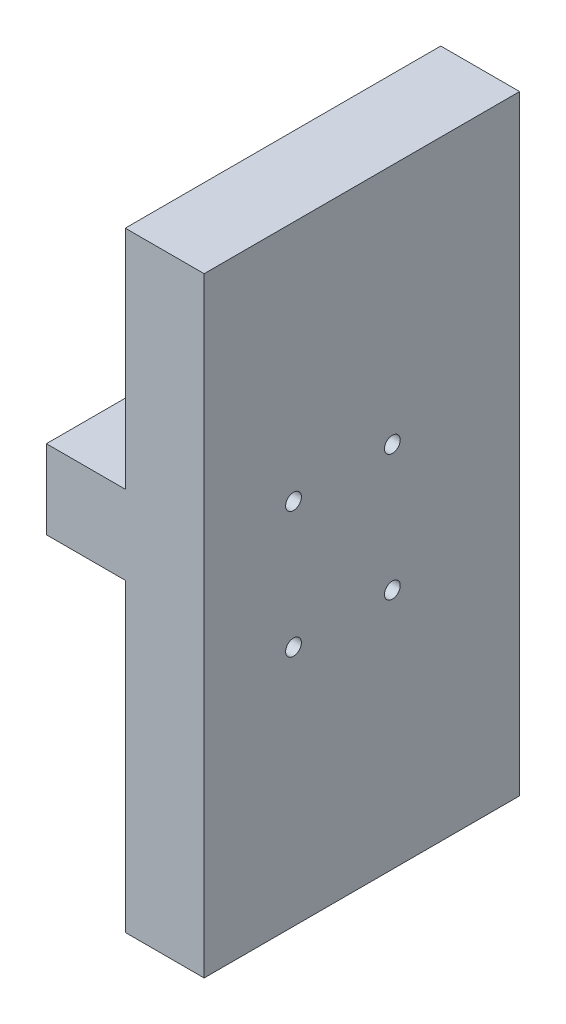
ISO-10303-21;
HEADER;
FILE_DESCRIPTION(('STEP AP214'),'2;1');
FILE_NAME('part.step','',(''),(''),'','','');
FILE_SCHEMA(('AUTOMOTIVE_DESIGN { 1 0 10303 214 1 1 1 1 }'));
ENDSEC;
DATA;
#1=APPLICATION_CONTEXT('core data for automotive mechanical design processes');
#2=APPLICATION_PROTOCOL_DEFINITION('international standard','automotive_design',2000,#1);
#3=PRODUCT_CONTEXT('',#1,'mechanical');
#4=PRODUCT('Part','Part','',(#3));
#5=PRODUCT_RELATED_PRODUCT_CATEGORY('part','',(#4));
#6=PRODUCT_DEFINITION_FORMATION('','',#4);
#7=PRODUCT_DEFINITION_CONTEXT('part definition',#1,'design');
#8=PRODUCT_DEFINITION('design','',#6,#7);
#9=PRODUCT_DEFINITION_SHAPE('','',#8);
#10=(LENGTH_UNIT() NAMED_UNIT(*) SI_UNIT(.MILLI.,.METRE.));
#11=(NAMED_UNIT(*) PLANE_ANGLE_UNIT() SI_UNIT($,.RADIAN.));
#12=(NAMED_UNIT(*) SI_UNIT($,.STERADIAN.) SOLID_ANGLE_UNIT());
#13=UNCERTAINTY_MEASURE_WITH_UNIT(LENGTH_MEASURE(1.E-05),#10,'distance_accuracy_value','');
#14=(GEOMETRIC_REPRESENTATION_CONTEXT(3) GLOBAL_UNCERTAINTY_ASSIGNED_CONTEXT((#13)) GLOBAL_UNIT_ASSIGNED_CONTEXT((#10,
#11,#12)) REPRESENTATION_CONTEXT('',''));
#15=CARTESIAN_POINT('',(0.,0.,0.));
#16=DIRECTION('',(0.,0.,1.));
#17=DIRECTION('',(1.,0.,0.));
#18=AXIS2_PLACEMENT_3D('',#15,#16,#17);
#19=CARTESIAN_POINT('',(0.,0.,0.));
#20=DIRECTION('',(-1.,0.,0.));
#21=DIRECTION('',(0.,0.,1.));
#22=AXIS2_PLACEMENT_3D('',#19,#20,#21);
#23=PLANE('',#22);
#24=CARTESIAN_POINT('',(0.,46.,-35.8));
#25=DIRECTION('',(-1.,0.,0.));
#26=DIRECTION('',(0.,0.,1.));
#27=AXIS2_PLACEMENT_3D('',#24,#25,#26);
#28=CIRCLE('',#27,1.5);
#29=CARTESIAN_POINT('',(0.,46.,-34.3));
#30=VERTEX_POINT('',#29);
#31=EDGE_CURVE('E258',#30,#30,#28,.T.);
#32=ORIENTED_EDGE('',*,*,#31,.F.);
#33=EDGE_LOOP('',(#32));
#34=FACE_BOUND('',#33,.T.);
#35=CARTESIAN_POINT('',(0.,70.,-35.8));
#36=DIRECTION('',(-1.,0.,0.));
#37=DIRECTION('',(0.,0.,1.));
#38=AXIS2_PLACEMENT_3D('',#35,#36,#37);
#39=CIRCLE('',#38,1.5);
#40=CARTESIAN_POINT('',(0.,70.,-34.3));
#41=VERTEX_POINT('',#40);
#42=EDGE_CURVE('E252',#41,#41,#39,.T.);
#43=ORIENTED_EDGE('',*,*,#42,.F.);
#44=EDGE_LOOP('',(#43));
#45=FACE_BOUND('',#44,.T.);
#46=CARTESIAN_POINT('',(0.,46.,-17.));
#47=DIRECTION('',(-1.,0.,0.));
#48=DIRECTION('',(0.,0.,1.));
#49=AXIS2_PLACEMENT_3D('',#46,#47,#48);
#50=CIRCLE('',#49,1.5);
#51=CARTESIAN_POINT('',(0.,46.,-15.5));
#52=VERTEX_POINT('',#51);
#53=EDGE_CURVE('E246',#52,#52,#50,.T.);
#54=ORIENTED_EDGE('',*,*,#53,.F.);
#55=EDGE_LOOP('',(#54));
#56=FACE_BOUND('',#55,.T.);
#57=CARTESIAN_POINT('',(0.,70.,-17.));
#58=DIRECTION('',(-1.,0.,0.));
#59=DIRECTION('',(0.,0.,1.));
#60=AXIS2_PLACEMENT_3D('',#57,#58,#59);
#61=CIRCLE('',#60,1.5);
#62=CARTESIAN_POINT('',(0.,70.,-15.5));
#63=VERTEX_POINT('',#62);
#64=EDGE_CURVE('E231',#63,#63,#61,.T.);
#65=ORIENTED_EDGE('',*,*,#64,.F.);
#66=EDGE_LOOP('',(#65));
#67=FACE_BOUND('',#66,.T.);
#68=DIRECTION('',(0.,-1.,0.));
#69=VECTOR('',#68,1.);
#70=CARTESIAN_POINT('',(0.,58.,-15.));
#71=LINE('',#70,#69);
#72=CARTESIAN_POINT('',(0.,73.,-15.));
#73=VERTEX_POINT('',#72);
#74=CARTESIAN_POINT('',(0.,58.,-15.));
#75=VERTEX_POINT('',#74);
#76=EDGE_CURVE('E230',#73,#75,#71,.T.);
#77=ORIENTED_EDGE('',*,*,#76,.F.);
#78=DIRECTION('',(0.,0.,-1.));
#79=VECTOR('',#78,1.);
#80=CARTESIAN_POINT('',(0.,73.,0.));
#81=LINE('',#80,#79);
#82=CARTESIAN_POINT('',(0.,73.,0.));
#83=VERTEX_POINT('',#82);
#84=EDGE_CURVE('E228',#83,#73,#81,.T.);
#85=ORIENTED_EDGE('',*,*,#84,.F.);
#86=DIRECTION('',(0.,-1.,0.));
#87=VECTOR('',#86,1.);
#88=CARTESIAN_POINT('',(0.,0.,0.));
#89=LINE('',#88,#87);
#90=CARTESIAN_POINT('',(0.,116.,0.));
#91=VERTEX_POINT('',#90);
#92=EDGE_CURVE('E148',#91,#83,#89,.T.);
#93=ORIENTED_EDGE('',*,*,#92,.F.);
#94=DIRECTION('',(0.,0.,1.));
#95=VECTOR('',#94,1.);
#96=CARTESIAN_POINT('',(0.,116.,0.));
#97=LINE('',#96,#95);
#98=CARTESIAN_POINT('',(0.,116.,-60.));
#99=VERTEX_POINT('',#98);
#100=EDGE_CURVE('E197',#99,#91,#97,.T.);
#101=ORIENTED_EDGE('',*,*,#100,.F.);
#102=DIRECTION('',(0.,1.,0.));
#103=VECTOR('',#102,1.);
#104=CARTESIAN_POINT('',(0.,0.,-60.));
#105=LINE('',#104,#103);
#106=CARTESIAN_POINT('',(0.,58.,-60.));
#107=VERTEX_POINT('',#106);
#108=EDGE_CURVE('E207',#107,#99,#105,.T.);
#109=ORIENTED_EDGE('',*,*,#108,.F.);
#110=DIRECTION('',(0.,0.,-1.));
#111=VECTOR('',#110,1.);
#112=CARTESIAN_POINT('',(0.,58.,-60.));
#113=LINE('',#112,#111);
#114=CARTESIAN_POINT('',(0.,58.,-45.));
#115=VERTEX_POINT('',#114);
#116=EDGE_CURVE('E58',#115,#107,#113,.T.);
#117=ORIENTED_EDGE('',*,*,#116,.F.);
#118=DIRECTION('',(0.,1.,0.));
#119=VECTOR('',#118,1.);
#120=CARTESIAN_POINT('',(0.,58.,-45.));
#121=LINE('',#120,#119);
#122=CARTESIAN_POINT('',(0.,43.,-45.));
#123=VERTEX_POINT('',#122);
#124=EDGE_CURVE('E152',#123,#115,#121,.T.);
#125=ORIENTED_EDGE('',*,*,#124,.F.);
#126=DIRECTION('',(0.,0.,1.));
#127=VECTOR('',#126,1.);
#128=CARTESIAN_POINT('',(0.,43.,-60.));
#129=LINE('',#128,#127);
#130=CARTESIAN_POINT('',(0.,43.,-60.));
#131=VERTEX_POINT('',#130);
#132=EDGE_CURVE('E149',#131,#123,#129,.T.);
#133=ORIENTED_EDGE('',*,*,#132,.F.);
#134=CARTESIAN_POINT('',(0.,0.,-60.));
#135=VERTEX_POINT('',#134);
#136=EDGE_CURVE('E214',#135,#131,#105,.T.);
#137=ORIENTED_EDGE('',*,*,#136,.F.);
#138=DIRECTION('',(0.,0.,-1.));
#139=VECTOR('',#138,1.);
#140=CARTESIAN_POINT('',(0.,0.,0.));
#141=LINE('',#140,#139);
#142=CARTESIAN_POINT('',(0.,0.,0.));
#143=VERTEX_POINT('',#142);
#144=EDGE_CURVE('E205',#143,#135,#141,.T.);
#145=ORIENTED_EDGE('',*,*,#144,.F.);
#146=CARTESIAN_POINT('',(0.,58.,0.));
#147=VERTEX_POINT('',#146);
#148=EDGE_CURVE('E191',#147,#143,#89,.T.);
#149=ORIENTED_EDGE('',*,*,#148,.F.);
#150=DIRECTION('',(0.,0.,1.));
#151=VECTOR('',#150,1.);
#152=CARTESIAN_POINT('',(0.,58.,0.));
#153=LINE('',#152,#151);
#154=EDGE_CURVE('E143',#75,#147,#153,.T.);
#155=ORIENTED_EDGE('',*,*,#154,.F.);
#156=EDGE_LOOP('',(#77,#85,#93,#101,#109,#117,#125,#133,#137,#145,#149,#155));
#157=FACE_BOUND('',#156,.T.);
#158=ADVANCED_FACE('F33',(#34,#45,#56,#67,#157),#23,.T.);
#159=CARTESIAN_POINT('',(15.,0.,0.));
#160=DIRECTION('',(0.,0.,-1.));
#161=DIRECTION('',(-1.,0.,0.));
#162=AXIS2_PLACEMENT_3D('',#159,#160,#161);
#163=PLANE('',#162);
#164=ORIENTED_EDGE('',*,*,#92,.T.);
#165=DIRECTION('',(1.,0.,0.));
#166=VECTOR('',#165,1.);
#167=CARTESIAN_POINT('',(-15.,73.,0.));
#168=LINE('',#167,#166);
#169=CARTESIAN_POINT('',(-15.,73.,0.));
#170=VERTEX_POINT('',#169);
#171=EDGE_CURVE('E128',#170,#83,#168,.T.);
#172=ORIENTED_EDGE('',*,*,#171,.F.);
#173=DIRECTION('',(0.,1.,0.));
#174=VECTOR('',#173,1.);
#175=CARTESIAN_POINT('',(-15.,58.,0.));
#176=LINE('',#175,#174);
#177=CARTESIAN_POINT('',(-15.,58.,0.));
#178=VERTEX_POINT('',#177);
#179=EDGE_CURVE('E135',#178,#170,#176,.T.);
#180=ORIENTED_EDGE('',*,*,#179,.F.);
#181=DIRECTION('',(1.,0.,0.));
#182=VECTOR('',#181,1.);
#183=CARTESIAN_POINT('',(-15.,58.,0.));
#184=LINE('',#183,#182);
#185=EDGE_CURVE('E241',#178,#147,#184,.T.);
#186=ORIENTED_EDGE('',*,*,#185,.T.);
#187=ORIENTED_EDGE('',*,*,#148,.T.);
#188=DIRECTION('',(-1.,0.,0.));
#189=VECTOR('',#188,1.);
#190=CARTESIAN_POINT('',(15.,0.,0.));
#191=LINE('',#190,#189);
#192=CARTESIAN_POINT('',(15.,0.,0.));
#193=VERTEX_POINT('',#192);
#194=EDGE_CURVE('E11',#193,#143,#191,.T.);
#195=ORIENTED_EDGE('',*,*,#194,.F.);
#196=DIRECTION('',(0.,-1.,0.));
#197=VECTOR('',#196,1.);
#198=CARTESIAN_POINT('',(15.,0.,0.));
#199=LINE('',#198,#197);
#200=CARTESIAN_POINT('',(15.,116.,0.));
#201=VERTEX_POINT('',#200);
#202=EDGE_CURVE('E193',#201,#193,#199,.T.);
#203=ORIENTED_EDGE('',*,*,#202,.F.);
#204=DIRECTION('',(-1.,0.,0.));
#205=VECTOR('',#204,1.);
#206=CARTESIAN_POINT('',(15.,116.,0.));
#207=LINE('',#206,#205);
#208=EDGE_CURVE('E203',#201,#91,#207,.T.);
#209=ORIENTED_EDGE('',*,*,#208,.T.);
#210=EDGE_LOOP('',(#164,#172,#180,#186,#187,#195,#203,#209));
#211=FACE_BOUND('',#210,.T.);
#212=ADVANCED_FACE('F35',(#211),#163,.F.);
#213=CARTESIAN_POINT('',(15.,0.,0.));
#214=DIRECTION('',(0.,1.,0.));
#215=DIRECTION('',(0.,0.,1.));
#216=AXIS2_PLACEMENT_3D('',#213,#214,#215);
#217=PLANE('',#216);
#218=ORIENTED_EDGE('',*,*,#144,.T.);
#219=DIRECTION('',(-1.,0.,0.));
#220=VECTOR('',#219,1.);
#221=CARTESIAN_POINT('',(15.,0.,-60.));
#222=LINE('',#221,#220);
#223=CARTESIAN_POINT('',(15.,0.,-60.));
#224=VERTEX_POINT('',#223);
#225=EDGE_CURVE('E42',#224,#135,#222,.T.);
#226=ORIENTED_EDGE('',*,*,#225,.F.);
#227=DIRECTION('',(0.,0.,-1.));
#228=VECTOR('',#227,1.);
#229=CARTESIAN_POINT('',(15.,0.,0.));
#230=LINE('',#229,#228);
#231=EDGE_CURVE('E196',#193,#224,#230,.T.);
#232=ORIENTED_EDGE('',*,*,#231,.F.);
#233=ORIENTED_EDGE('',*,*,#194,.T.);
#234=EDGE_LOOP('',(#218,#226,#232,#233));
#235=FACE_BOUND('',#234,.T.);
#236=ADVANCED_FACE('F282',(#235),#217,.F.);
#237=CARTESIAN_POINT('',(15.,0.,-60.));
#238=DIRECTION('',(0.,0.,1.));
#239=DIRECTION('',(1.,0.,0.));
#240=AXIS2_PLACEMENT_3D('',#237,#238,#239);
#241=PLANE('',#240);
#242=ORIENTED_EDGE('',*,*,#136,.T.);
#243=DIRECTION('',(1.,0.,0.));
#244=VECTOR('',#243,1.);
#245=CARTESIAN_POINT('',(-15.,43.,-60.));
#246=LINE('',#245,#244);
#247=CARTESIAN_POINT('',(-15.,43.,-60.));
#248=VERTEX_POINT('',#247);
#249=EDGE_CURVE('E186',#248,#131,#246,.T.);
#250=ORIENTED_EDGE('',*,*,#249,.F.);
#251=DIRECTION('',(0.,-1.,0.));
#252=VECTOR('',#251,1.);
#253=CARTESIAN_POINT('',(-15.,58.,-60.));
#254=LINE('',#253,#252);
#255=CARTESIAN_POINT('',(-15.,58.,-60.));
#256=VERTEX_POINT('',#255);
#257=EDGE_CURVE('E157',#256,#248,#254,.T.);
#258=ORIENTED_EDGE('',*,*,#257,.F.);
#259=DIRECTION('',(1.,0.,0.));
#260=VECTOR('',#259,1.);
#261=CARTESIAN_POINT('',(-15.,58.,-60.));
#262=LINE('',#261,#260);
#263=EDGE_CURVE('E166',#256,#107,#262,.T.);
#264=ORIENTED_EDGE('',*,*,#263,.T.);
#265=ORIENTED_EDGE('',*,*,#108,.T.);
#266=DIRECTION('',(-1.,0.,0.));
#267=VECTOR('',#266,1.);
#268=CARTESIAN_POINT('',(15.,116.,-60.));
#269=LINE('',#268,#267);
#270=CARTESIAN_POINT('',(15.,116.,-60.));
#271=VERTEX_POINT('',#270);
#272=EDGE_CURVE('E219',#271,#99,#269,.T.);
#273=ORIENTED_EDGE('',*,*,#272,.F.);
#274=DIRECTION('',(0.,1.,0.));
#275=VECTOR('',#274,1.);
#276=CARTESIAN_POINT('',(15.,0.,-60.));
#277=LINE('',#276,#275);
#278=EDGE_CURVE('E199',#224,#271,#277,.T.);
#279=ORIENTED_EDGE('',*,*,#278,.F.);
#280=ORIENTED_EDGE('',*,*,#225,.T.);
#281=EDGE_LOOP('',(#242,#250,#258,#264,#265,#273,#279,#280));
#282=FACE_BOUND('',#281,.T.);
#283=ADVANCED_FACE('F286',(#282),#241,.F.);
#284=CARTESIAN_POINT('',(15.,116.,0.));
#285=DIRECTION('',(0.,-1.,0.));
#286=DIRECTION('',(0.,0.,-1.));
#287=AXIS2_PLACEMENT_3D('',#284,#285,#286);
#288=PLANE('',#287);
#289=ORIENTED_EDGE('',*,*,#100,.T.);
#290=ORIENTED_EDGE('',*,*,#208,.F.);
#291=DIRECTION('',(0.,0.,1.));
#292=VECTOR('',#291,1.);
#293=CARTESIAN_POINT('',(15.,116.,0.));
#294=LINE('',#293,#292);
#295=EDGE_CURVE('E201',#271,#201,#294,.T.);
#296=ORIENTED_EDGE('',*,*,#295,.F.);
#297=ORIENTED_EDGE('',*,*,#272,.T.);
#298=EDGE_LOOP('',(#289,#290,#296,#297));
#299=FACE_BOUND('',#298,.T.);
#300=ADVANCED_FACE('F271',(#299),#288,.F.);
#301=CARTESIAN_POINT('',(15.,0.,0.));
#302=DIRECTION('',(-1.,0.,0.));
#303=DIRECTION('',(0.,0.,1.));
#304=AXIS2_PLACEMENT_3D('',#301,#302,#303);
#305=PLANE('',#304);
#306=CARTESIAN_POINT('',(15.,46.,-35.8));
#307=DIRECTION('',(1.,0.,0.));
#308=DIRECTION('',(0.,0.,-1.));
#309=AXIS2_PLACEMENT_3D('',#306,#307,#308);
#310=CIRCLE('',#309,1.5);
#311=CARTESIAN_POINT('',(15.,46.,-37.3));
#312=VERTEX_POINT('',#311);
#313=EDGE_CURVE('E261',#312,#312,#310,.T.);
#314=ORIENTED_EDGE('',*,*,#313,.F.);
#315=EDGE_LOOP('',(#314));
#316=FACE_BOUND('',#315,.T.);
#317=CARTESIAN_POINT('',(15.,70.,-35.8));
#318=DIRECTION('',(1.,0.,0.));
#319=DIRECTION('',(0.,0.,-1.));
#320=AXIS2_PLACEMENT_3D('',#317,#318,#319);
#321=CIRCLE('',#320,1.5);
#322=CARTESIAN_POINT('',(15.,70.,-37.3));
#323=VERTEX_POINT('',#322);
#324=EDGE_CURVE('E255',#323,#323,#321,.T.);
#325=ORIENTED_EDGE('',*,*,#324,.F.);
#326=EDGE_LOOP('',(#325));
#327=FACE_BOUND('',#326,.T.);
#328=CARTESIAN_POINT('',(15.,46.,-17.));
#329=DIRECTION('',(1.,0.,0.));
#330=DIRECTION('',(0.,0.,-1.));
#331=AXIS2_PLACEMENT_3D('',#328,#329,#330);
#332=CIRCLE('',#331,1.5);
#333=CARTESIAN_POINT('',(15.,46.,-18.5));
#334=VERTEX_POINT('',#333);
#335=EDGE_CURVE('E249',#334,#334,#332,.T.);
#336=ORIENTED_EDGE('',*,*,#335,.F.);
#337=EDGE_LOOP('',(#336));
#338=FACE_BOUND('',#337,.T.);
#339=CARTESIAN_POINT('',(15.,70.,-17.));
#340=DIRECTION('',(1.,0.,0.));
#341=DIRECTION('',(0.,0.,-1.));
#342=AXIS2_PLACEMENT_3D('',#339,#340,#341);
#343=CIRCLE('',#342,1.5);
#344=CARTESIAN_POINT('',(15.,70.,-18.5));
#345=VERTEX_POINT('',#344);
#346=EDGE_CURVE('E235',#345,#345,#343,.T.);
#347=ORIENTED_EDGE('',*,*,#346,.F.);
#348=EDGE_LOOP('',(#347));
#349=FACE_BOUND('',#348,.T.);
#350=ORIENTED_EDGE('',*,*,#202,.T.);
#351=ORIENTED_EDGE('',*,*,#231,.T.);
#352=ORIENTED_EDGE('',*,*,#278,.T.);
#353=ORIENTED_EDGE('',*,*,#295,.T.);
#354=EDGE_LOOP('',(#350,#351,#352,#353));
#355=FACE_BOUND('',#354,.T.);
#356=ADVANCED_FACE('F267',(#316,#327,#338,#349,#355),#305,.F.);
#357=CARTESIAN_POINT('',(-15.,43.,-60.));
#358=DIRECTION('',(0.,1.,0.));
#359=DIRECTION('',(0.,0.,1.));
#360=AXIS2_PLACEMENT_3D('',#357,#358,#359);
#361=PLANE('',#360);
#362=ORIENTED_EDGE('',*,*,#132,.T.);
#363=DIRECTION('',(1.,0.,0.));
#364=VECTOR('',#363,1.);
#365=CARTESIAN_POINT('',(-15.,43.,-45.));
#366=LINE('',#365,#364);
#367=CARTESIAN_POINT('',(-15.,43.,-45.));
#368=VERTEX_POINT('',#367);
#369=EDGE_CURVE('E181',#368,#123,#366,.T.);
#370=ORIENTED_EDGE('',*,*,#369,.F.);
#371=DIRECTION('',(0.,0.,1.));
#372=VECTOR('',#371,1.);
#373=CARTESIAN_POINT('',(-15.,43.,-60.));
#374=LINE('',#373,#372);
#375=EDGE_CURVE('E160',#248,#368,#374,.T.);
#376=ORIENTED_EDGE('',*,*,#375,.F.);
#377=ORIENTED_EDGE('',*,*,#249,.T.);
#378=EDGE_LOOP('',(#362,#370,#376,#377));
#379=FACE_BOUND('',#378,.T.);
#380=ADVANCED_FACE('F270',(#379),#361,.F.);
#381=CARTESIAN_POINT('',(-15.,58.,-45.));
#382=DIRECTION('',(0.,0.,-1.));
#383=DIRECTION('',(-1.,0.,0.));
#384=AXIS2_PLACEMENT_3D('',#381,#382,#383);
#385=PLANE('',#384);
#386=ORIENTED_EDGE('',*,*,#124,.T.);
#387=DIRECTION('',(1.,0.,0.));
#388=VECTOR('',#387,1.);
#389=CARTESIAN_POINT('',(-15.,58.,-45.));
#390=LINE('',#389,#388);
#391=CARTESIAN_POINT('',(-15.,58.,-45.));
#392=VERTEX_POINT('',#391);
#393=EDGE_CURVE('E170',#392,#115,#390,.T.);
#394=ORIENTED_EDGE('',*,*,#393,.F.);
#395=DIRECTION('',(0.,1.,0.));
#396=VECTOR('',#395,1.);
#397=CARTESIAN_POINT('',(-15.,58.,-45.));
#398=LINE('',#397,#396);
#399=EDGE_CURVE('E162',#368,#392,#398,.T.);
#400=ORIENTED_EDGE('',*,*,#399,.F.);
#401=ORIENTED_EDGE('',*,*,#369,.T.);
#402=EDGE_LOOP('',(#386,#394,#400,#401));
#403=FACE_BOUND('',#402,.T.);
#404=ADVANCED_FACE('F306',(#403),#385,.F.);
#405=CARTESIAN_POINT('',(-15.,58.,-60.));
#406=DIRECTION('',(0.,-1.,0.));
#407=DIRECTION('',(0.,0.,-1.));
#408=AXIS2_PLACEMENT_3D('',#405,#406,#407);
#409=PLANE('',#408);
#410=ORIENTED_EDGE('',*,*,#116,.T.);
#411=ORIENTED_EDGE('',*,*,#263,.F.);
#412=DIRECTION('',(0.,0.,-1.));
#413=VECTOR('',#412,1.);
#414=CARTESIAN_POINT('',(-15.,58.,-60.));
#415=LINE('',#414,#413);
#416=EDGE_CURVE('E164',#392,#256,#415,.T.);
#417=ORIENTED_EDGE('',*,*,#416,.F.);
#418=ORIENTED_EDGE('',*,*,#393,.T.);
#419=EDGE_LOOP('',(#410,#411,#417,#418));
#420=FACE_BOUND('',#419,.T.);
#421=ADVANCED_FACE('F310',(#420),#409,.F.);
#422=CARTESIAN_POINT('',(-15.,0.,0.));
#423=DIRECTION('',(-1.,0.,0.));
#424=DIRECTION('',(0.,0.,1.));
#425=AXIS2_PLACEMENT_3D('',#422,#423,#424);
#426=PLANE('',#425);
#427=ORIENTED_EDGE('',*,*,#257,.T.);
#428=ORIENTED_EDGE('',*,*,#375,.T.);
#429=ORIENTED_EDGE('',*,*,#399,.T.);
#430=ORIENTED_EDGE('',*,*,#416,.T.);
#431=EDGE_LOOP('',(#427,#428,#429,#430));
#432=FACE_BOUND('',#431,.T.);
#433=ADVANCED_FACE('F313',(#432),#426,.T.);
#434=CARTESIAN_POINT('',(-15.,73.,0.));
#435=DIRECTION('',(0.,-1.,0.));
#436=DIRECTION('',(0.,0.,-1.));
#437=AXIS2_PLACEMENT_3D('',#434,#435,#436);
#438=PLANE('',#437);
#439=ORIENTED_EDGE('',*,*,#84,.T.);
#440=DIRECTION('',(1.,0.,0.));
#441=VECTOR('',#440,1.);
#442=CARTESIAN_POINT('',(-15.,73.,-15.));
#443=LINE('',#442,#441);
#444=CARTESIAN_POINT('',(-15.,73.,-15.));
#445=VERTEX_POINT('',#444);
#446=EDGE_CURVE('E131',#445,#73,#443,.T.);
#447=ORIENTED_EDGE('',*,*,#446,.F.);
#448=DIRECTION('',(0.,0.,-1.));
#449=VECTOR('',#448,1.);
#450=CARTESIAN_POINT('',(-15.,73.,0.));
#451=LINE('',#450,#449);
#452=EDGE_CURVE('E124',#170,#445,#451,.T.);
#453=ORIENTED_EDGE('',*,*,#452,.F.);
#454=ORIENTED_EDGE('',*,*,#171,.T.);
#455=EDGE_LOOP('',(#439,#447,#453,#454));
#456=FACE_BOUND('',#455,.T.);
#457=ADVANCED_FACE('F126',(#456),#438,.F.);
#458=CARTESIAN_POINT('',(-15.,58.,-15.));
#459=DIRECTION('',(0.,0.,1.));
#460=DIRECTION('',(1.,0.,0.));
#461=AXIS2_PLACEMENT_3D('',#458,#459,#460);
#462=PLANE('',#461);
#463=ORIENTED_EDGE('',*,*,#76,.T.);
#464=DIRECTION('',(1.,0.,0.));
#465=VECTOR('',#464,1.);
#466=CARTESIAN_POINT('',(-15.,58.,-15.));
#467=LINE('',#466,#465);
#468=CARTESIAN_POINT('',(-15.,58.,-15.));
#469=VERTEX_POINT('',#468);
#470=EDGE_CURVE('E50',#469,#75,#467,.T.);
#471=ORIENTED_EDGE('',*,*,#470,.F.);
#472=DIRECTION('',(0.,-1.,0.));
#473=VECTOR('',#472,1.);
#474=CARTESIAN_POINT('',(-15.,58.,-15.));
#475=LINE('',#474,#473);
#476=EDGE_CURVE('E134',#445,#469,#475,.T.);
#477=ORIENTED_EDGE('',*,*,#476,.F.);
#478=ORIENTED_EDGE('',*,*,#446,.T.);
#479=EDGE_LOOP('',(#463,#471,#477,#478));
#480=FACE_BOUND('',#479,.T.);
#481=ADVANCED_FACE('F319',(#480),#462,.F.);
#482=CARTESIAN_POINT('',(-15.,58.,0.));
#483=DIRECTION('',(0.,1.,0.));
#484=DIRECTION('',(0.,0.,1.));
#485=AXIS2_PLACEMENT_3D('',#482,#483,#484);
#486=PLANE('',#485);
#487=ORIENTED_EDGE('',*,*,#154,.T.);
#488=ORIENTED_EDGE('',*,*,#185,.F.);
#489=DIRECTION('',(0.,0.,1.));
#490=VECTOR('',#489,1.);
#491=CARTESIAN_POINT('',(-15.,58.,0.));
#492=LINE('',#491,#490);
#493=EDGE_CURVE('E139',#469,#178,#492,.T.);
#494=ORIENTED_EDGE('',*,*,#493,.F.);
#495=ORIENTED_EDGE('',*,*,#470,.T.);
#496=EDGE_LOOP('',(#487,#488,#494,#495));
#497=FACE_BOUND('',#496,.T.);
#498=ADVANCED_FACE('F322',(#497),#486,.F.);
#499=CARTESIAN_POINT('',(-15.,0.,0.));
#500=DIRECTION('',(-1.,0.,0.));
#501=DIRECTION('',(0.,0.,1.));
#502=AXIS2_PLACEMENT_3D('',#499,#500,#501);
#503=PLANE('',#502);
#504=ORIENTED_EDGE('',*,*,#179,.T.);
#505=ORIENTED_EDGE('',*,*,#452,.T.);
#506=ORIENTED_EDGE('',*,*,#476,.T.);
#507=ORIENTED_EDGE('',*,*,#493,.T.);
#508=EDGE_LOOP('',(#504,#505,#506,#507));
#509=FACE_BOUND('',#508,.T.);
#510=ADVANCED_FACE('F138',(#509),#503,.T.);
#511=CARTESIAN_POINT('',(-15.000025,70.,-17.));
#512=DIRECTION('',(1.,0.,0.));
#513=DIRECTION('',(0.,0.,-1.));
#514=AXIS2_PLACEMENT_3D('',#511,#512,#513);
#515=CYLINDRICAL_SURFACE('',#514,1.5);
#516=ORIENTED_EDGE('',*,*,#64,.T.);
#517=EDGE_LOOP('',(#516));
#518=FACE_BOUND('',#517,.T.);
#519=ORIENTED_EDGE('',*,*,#346,.T.);
#520=EDGE_LOOP('',(#519));
#521=FACE_BOUND('',#520,.T.);
#522=ADVANCED_FACE('F328',(#518,#521),#515,.F.);
#523=CARTESIAN_POINT('',(-15.000025,46.,-17.));
#524=DIRECTION('',(1.,0.,0.));
#525=DIRECTION('',(0.,0.,-1.));
#526=AXIS2_PLACEMENT_3D('',#523,#524,#525);
#527=CYLINDRICAL_SURFACE('',#526,1.5);
#528=ORIENTED_EDGE('',*,*,#53,.T.);
#529=EDGE_LOOP('',(#528));
#530=FACE_BOUND('',#529,.T.);
#531=ORIENTED_EDGE('',*,*,#335,.T.);
#532=EDGE_LOOP('',(#531));
#533=FACE_BOUND('',#532,.T.);
#534=ADVANCED_FACE('F331',(#530,#533),#527,.F.);
#535=CARTESIAN_POINT('',(-15.000025,70.,-35.8));
#536=DIRECTION('',(1.,0.,0.));
#537=DIRECTION('',(0.,0.,-1.));
#538=AXIS2_PLACEMENT_3D('',#535,#536,#537);
#539=CYLINDRICAL_SURFACE('',#538,1.5);
#540=ORIENTED_EDGE('',*,*,#42,.T.);
#541=EDGE_LOOP('',(#540));
#542=FACE_BOUND('',#541,.T.);
#543=ORIENTED_EDGE('',*,*,#324,.T.);
#544=EDGE_LOOP('',(#543));
#545=FACE_BOUND('',#544,.T.);
#546=ADVANCED_FACE('F335',(#542,#545),#539,.F.);
#547=CARTESIAN_POINT('',(-15.000025,46.,-35.8));
#548=DIRECTION('',(1.,0.,0.));
#549=DIRECTION('',(0.,0.,-1.));
#550=AXIS2_PLACEMENT_3D('',#547,#548,#549);
#551=CYLINDRICAL_SURFACE('',#550,1.5);
#552=ORIENTED_EDGE('',*,*,#31,.T.);
#553=EDGE_LOOP('',(#552));
#554=FACE_BOUND('',#553,.T.);
#555=ORIENTED_EDGE('',*,*,#313,.T.);
#556=EDGE_LOOP('',(#555));
#557=FACE_BOUND('',#556,.T.);
#558=ADVANCED_FACE('F265',(#554,#557),#551,.F.);
#559=CLOSED_SHELL('',(#158,#212,#236,#283,#300,#356,#380,#404,#421,#433,#457,#481,#498,#510,
#522,#534,#546,#558));
#560=MANIFOLD_SOLID_BREP('B2',#559);
#561=ADVANCED_BREP_SHAPE_REPRESENTATION('',(#18,#560),#14);
#562=SHAPE_DEFINITION_REPRESENTATION(#9,#561);
ENDSEC;
END-ISO-10303-21;
